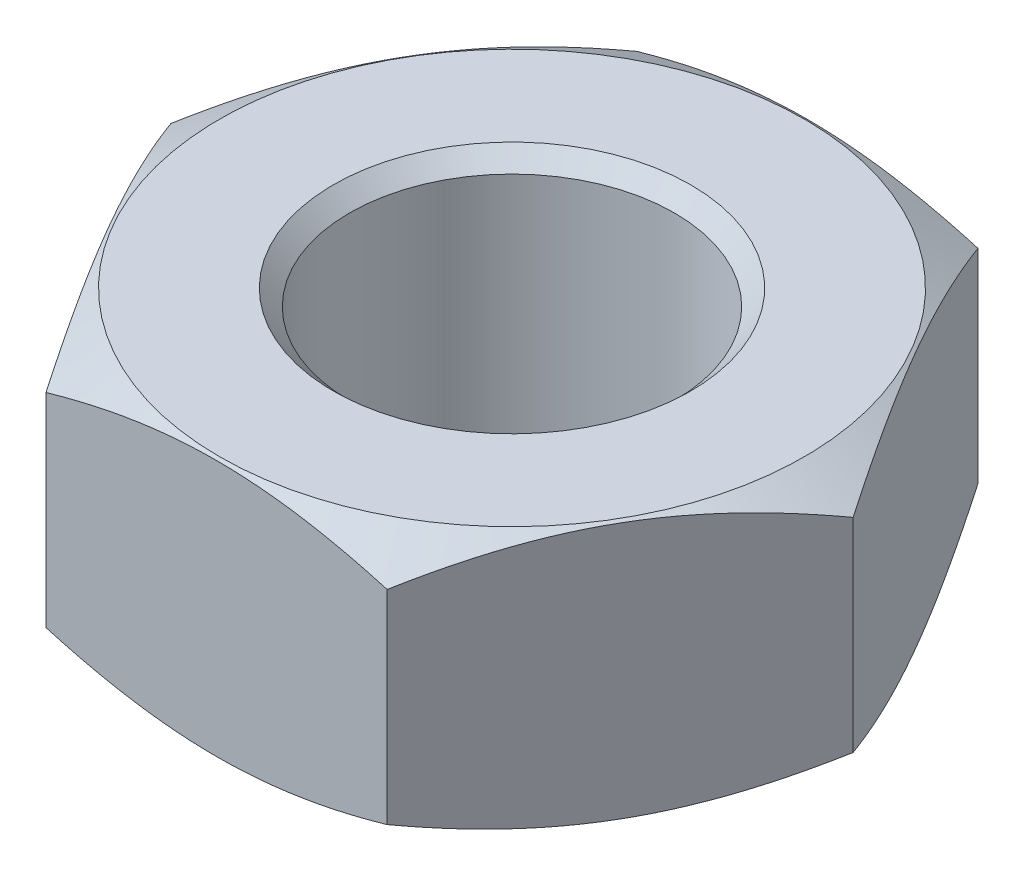
ISO-10303-21;
HEADER;
FILE_DESCRIPTION(('STEP AP214'),'2;1');
FILE_NAME('part.step','',(''),(''),'','','');
FILE_SCHEMA(('AUTOMOTIVE_DESIGN { 1 0 10303 214 1 1 1 1 }'));
ENDSEC;
DATA;
#1=APPLICATION_CONTEXT('core data for automotive mechanical design processes');
#2=APPLICATION_PROTOCOL_DEFINITION('international standard','automotive_design',2000,#1);
#3=PRODUCT_CONTEXT('',#1,'mechanical');
#4=PRODUCT('Part','Part','',(#3));
#5=PRODUCT_RELATED_PRODUCT_CATEGORY('part','',(#4));
#6=PRODUCT_DEFINITION_FORMATION('','',#4);
#7=PRODUCT_DEFINITION_CONTEXT('part definition',#1,'design');
#8=PRODUCT_DEFINITION('design','',#6,#7);
#9=PRODUCT_DEFINITION_SHAPE('','',#8);
#10=(LENGTH_UNIT() NAMED_UNIT(*) SI_UNIT(.MILLI.,.METRE.));
#11=(NAMED_UNIT(*) PLANE_ANGLE_UNIT() SI_UNIT($,.RADIAN.));
#12=(NAMED_UNIT(*) SI_UNIT($,.STERADIAN.) SOLID_ANGLE_UNIT());
#13=UNCERTAINTY_MEASURE_WITH_UNIT(LENGTH_MEASURE(1.E-05),#10,'distance_accuracy_value','');
#14=(GEOMETRIC_REPRESENTATION_CONTEXT(3) GLOBAL_UNCERTAINTY_ASSIGNED_CONTEXT((#13)) GLOBAL_UNIT_ASSIGNED_CONTEXT((#10,
#11,#12)) REPRESENTATION_CONTEXT('',''));
#15=CARTESIAN_POINT('',(0.,0.,0.));
#16=DIRECTION('',(0.,0.,1.));
#17=DIRECTION('',(1.,0.,0.));
#18=AXIS2_PLACEMENT_3D('',#15,#16,#17);
#19=CARTESIAN_POINT('',(-2.10000000237023,-1.6,0.));
#20=DIRECTION('',(-0.86602540378444,0.,-0.499999999999998));
#21=DIRECTION('',(-0.499999999999998,0.,0.86602540378444));
#22=AXIS2_PLACEMENT_3D('',#19,#20,#21);
#23=PLANE('',#22);
#24=CARTESIAN_POINT('',(-2.10011547242407,-1.42672824570972,0.000200000000008293));
#25=CARTESIAN_POINT('',(-2.05397238263355,-1.45338104386222,-0.0797221759353795));
#26=CARTESIAN_POINT('',(-2.00743099065545,-1.47762120515649,-0.16033423149643));
#27=CARTESIAN_POINT('',(-1.91354221479608,-1.51993359810462,-0.322954361545311));
#28=CARTESIAN_POINT('',(-1.86619316205928,-1.53799085955126,-0.404965326575708));
#29=CARTESIAN_POINT('',(-1.77208188818961,-1.56610091500609,-0.567970834482999));
#30=CARTESIAN_POINT('',(-1.72533415116147,-1.57634077429775,-0.648940290154616));
#31=CARTESIAN_POINT('',(-1.63161859927618,-1.58856728304991,-0.811260387479292));
#32=CARTESIAN_POINT('',(-1.58465112528045,-1.59056405473751,-0.89261043874307));
#33=CARTESIAN_POINT('',(-1.49688221921603,-1.58642049807779,-1.04463064337138));
#34=CARTESIAN_POINT('',(-1.45606767978037,-1.58129755658569,-1.11532349936147));
#35=CARTESIAN_POINT('',(-1.37470452019889,-1.56505760045516,-1.25624862562092));
#36=CARTESIAN_POINT('',(-1.33415618168559,-1.55393503279865,-1.32648040808847));
#37=CARTESIAN_POINT('',(-1.25262512890387,-1.52612820004511,-1.46769633390099));
#38=CARTESIAN_POINT('',(-1.21165273903499,-1.50932600741531,-1.53866259486141));
#39=CARTESIAN_POINT('',(-1.13031921847631,-1.47119114859348,-1.67953638482748));
#40=CARTESIAN_POINT('',(-1.08995704496168,-1.44986744868072,-1.74944572005874));
#41=CARTESIAN_POINT('',(-1.04988453113128,-1.42672824570972,-1.81885335));
#42=B_SPLINE_CURVE_WITH_KNOTS('',3,(#24,#25,#26,#27,#28,#29,#30,#31,#32,#33,#34,#35,#36,#37,#38,
#39,#40,#41),.UNSPECIFIED.,.F.,.F.,(4,2,2,2,2,2,2,2,4),(0.,0.288286928960491,0.577267010492272,
0.859094188183863,1.14057518869683,1.38571082227618,1.63107373404998,1.88188077320061,
2.13219502990154),.UNSPECIFIED.);
#43=CARTESIAN_POINT('',(-2.10000000237023,-1.42679491787466,0.));
#44=VERTEX_POINT('',#43);
#45=CARTESIAN_POINT('',(-1.05000000118512,-1.42679491787466,-1.81865335));
#46=VERTEX_POINT('',#45);
#47=EDGE_CURVE('E165',#44,#46,#42,.T.);
#48=ORIENTED_EDGE('',*,*,#47,.F.);
#49=DIRECTION('',(0.,1.,0.));
#50=VECTOR('',#49,1.);
#51=CARTESIAN_POINT('',(-2.10000000237023,-1.6,0.));
#52=LINE('',#51,#50);
#53=CARTESIAN_POINT('',(-2.10000000237023,-0.173205082125339,0.));
#54=VERTEX_POINT('',#53);
#55=EDGE_CURVE('E52',#44,#54,#52,.T.);
#56=ORIENTED_EDGE('',*,*,#55,.T.);
#57=CARTESIAN_POINT('',(-1.04988453113128,-0.173271754290277,-1.81885335));
#58=CARTESIAN_POINT('',(-1.0960276209218,-0.146618956137781,-1.73893117406461));
#59=CARTESIAN_POINT('',(-1.1425690128999,-0.122378794843514,-1.65831911850356));
#60=CARTESIAN_POINT('',(-1.23645778875927,-0.0800664018953775,-1.49569898845468));
#61=CARTESIAN_POINT('',(-1.28380684149607,-0.0620091404487364,-1.41368802342428));
#62=CARTESIAN_POINT('',(-1.37791811536574,-0.0338990849939134,-1.25068251551699));
#63=CARTESIAN_POINT('',(-1.42466585239388,-0.0236592257022503,-1.16971305984538));
#64=CARTESIAN_POINT('',(-1.51838140427917,-0.0114327169500914,-1.0073929625207));
#65=CARTESIAN_POINT('',(-1.5653488782749,-0.00943594526248743,-0.926042911256921));
#66=CARTESIAN_POINT('',(-1.65311778433932,-0.0135795019222064,-0.774022706628614));
#67=CARTESIAN_POINT('',(-1.69393232377498,-0.0187024434143125,-0.703329850638519));
#68=CARTESIAN_POINT('',(-1.77529548335645,-0.0349423995448412,-0.56240472437907));
#69=CARTESIAN_POINT('',(-1.81584382186976,-0.0460649672013528,-0.492172941911518));
#70=CARTESIAN_POINT('',(-1.89737487465148,-0.0738717999548946,-0.350957016098998));
#71=CARTESIAN_POINT('',(-1.93834726452036,-0.090673992584695,-0.27999075513858));
#72=CARTESIAN_POINT('',(-2.01968078507903,-0.128808851406522,-0.139116965172509));
#73=CARTESIAN_POINT('',(-2.06004295859367,-0.15013255131928,-0.0692076299412518));
#74=CARTESIAN_POINT('',(-2.10011547242407,-0.173271754290277,0.000200000000008304));
#75=B_SPLINE_CURVE_WITH_KNOTS('',3,(#57,#58,#59,#60,#61,#62,#63,#64,#65,#66,#67,#68,#69,#70,#71,
#72,#73,#74),.UNSPECIFIED.,.F.,.F.,(4,2,2,2,2,2,2,2,4),(0.,0.288286928960491,0.577267010492272,
0.859094188183863,1.14057518869683,1.38571082227618,1.63107373404998,1.88188077320061,
2.13219502990154),.UNSPECIFIED.);
#76=CARTESIAN_POINT('',(-1.05000000118512,-0.173205082125339,-1.81865335));
#77=VERTEX_POINT('',#76);
#78=EDGE_CURVE('E112',#77,#54,#75,.T.);
#79=ORIENTED_EDGE('',*,*,#78,.F.);
#80=DIRECTION('',(0.,1.,0.));
#81=VECTOR('',#80,1.);
#82=CARTESIAN_POINT('',(-1.05000000118512,-1.6,-1.81865335));
#83=LINE('',#82,#81);
#84=EDGE_CURVE('E117',#46,#77,#83,.T.);
#85=ORIENTED_EDGE('',*,*,#84,.F.);
#86=EDGE_LOOP('',(#48,#56,#79,#85));
#87=FACE_BOUND('',#86,.T.);
#88=ADVANCED_FACE('F29',(#87),#23,.T.);
#89=CARTESIAN_POINT('',(-1.05000000118512,-1.6,-1.81865335));
#90=DIRECTION('',(0.,0.,-1.));
#91=DIRECTION('',(-1.,0.,0.));
#92=AXIS2_PLACEMENT_3D('',#89,#90,#91);
#93=PLANE('',#92);
#94=CARTESIAN_POINT('',(-2.7832612700738,-0.719678166511685,-1.81865335));
#95=CARTESIAN_POINT('',(-2.70342372155906,-0.758253875418694,-1.81865335));
#96=CARTESIAN_POINT('',(-2.6233972415429,-0.796445651858814,-1.81865335));
#97=CARTESIAN_POINT('',(-2.46286425560241,-0.871841912645935,-1.81865335));
#98=CARTESIAN_POINT('',(-2.38235766932415,-0.909046225701725,-1.81865335));
#99=CARTESIAN_POINT('',(-2.22032668005602,-0.982444452958837,-1.81865335));
#100=CARTESIAN_POINT('',(-2.13879908801237,-1.01863135259055,-1.81865335));
#101=CARTESIAN_POINT('',(-1.97507326653739,-1.08944868357841,-1.81865335));
#102=CARTESIAN_POINT('',(-1.89287507238346,-1.12407919619328,-1.81865335));
#103=CARTESIAN_POINT('',(-1.72666416503013,-1.19177797582275,-1.81865335));
#104=CARTESIAN_POINT('',(-1.64264154679091,-1.22482205798241,-1.81865335));
#105=CARTESIAN_POINT('',(-1.47360407595019,-1.28831874817367,-1.81865335));
#106=CARTESIAN_POINT('',(-1.38858910652799,-1.31877104752658,-1.81865335));
#107=CARTESIAN_POINT('',(-1.21761127063947,-1.37626323007243,-1.81865335));
#108=CARTESIAN_POINT('',(-1.13165092346202,-1.40331052878013,-1.81865335));
#109=CARTESIAN_POINT('',(-0.958501219430261,-1.45311713415704,-1.81865335));
#110=CARTESIAN_POINT('',(-0.871312155804668,-1.47587744588,-1.81865335));
#111=CARTESIAN_POINT('',(-0.69565519737154,-1.51600043048016,-1.81865335));
#112=CARTESIAN_POINT('',(-0.607187001422664,-1.53336180991866,-1.81865335));
#113=CARTESIAN_POINT('',(-0.429186326856783,-1.56151878870486,-1.81865335));
#114=CARTESIAN_POINT('',(-0.339653847029726,-1.57231438058678,-1.81865335));
#115=CARTESIAN_POINT('',(-0.160555912135001,-1.58638171668875,-1.81865335));
#116=CARTESIAN_POINT('',(-0.0709942979807151,-1.58970093661517,-1.81865335));
#117=CARTESIAN_POINT('',(0.108054607245679,-1.58865102717667,-1.81865335));
#118=CARTESIAN_POINT('',(0.197541911548648,-1.58428388586576,-1.81865335));
#119=CARTESIAN_POINT('',(0.414124965282245,-1.56480056661687,-1.81865335));
#120=CARTESIAN_POINT('',(0.540878771012093,-1.54587559981539,-1.81865335));
#121=CARTESIAN_POINT('',(0.792038298823614,-1.49602046956849,-1.81865335));
#122=CARTESIAN_POINT('',(0.916441072917053,-1.46507616291958,-1.81865335));
#123=CARTESIAN_POINT('',(1.10262559572244,-1.41172648055705,-1.81865335));
#124=CARTESIAN_POINT('',(1.16535961271617,-1.39251631221724,-1.81865335));
#125=CARTESIAN_POINT('',(1.29016933189334,-1.35219760100933,-1.81865335));
#126=CARTESIAN_POINT('',(1.35224545593244,-1.33109036870646,-1.81865335));
#127=CARTESIAN_POINT('',(1.47548420013221,-1.28741728061417,-1.81865335));
#128=CARTESIAN_POINT('',(1.53664999612024,-1.26486030924131,-1.81865335));
#129=CARTESIAN_POINT('',(1.65850729578319,-1.21842444820772,-1.81865335));
#130=CARTESIAN_POINT('',(1.7191985957868,-1.19454502301362,-1.81865335));
#131=CARTESIAN_POINT('',(1.77967015229902,-1.17013486041854,-1.81865335));
#132=B_SPLINE_CURVE_WITH_KNOTS('',3,(#94,#95,#96,#97,#98,#99,#100,#101,#102,#103,#104,#105,#106,
#107,#108,#109,#110,#111,#112,#113,#114,#115,#116,#117,#118,#119,#120,#121,#122,#123,#124,#125,
#126,#127,#128,#129,#130,#131),.UNSPECIFIED.,.F.,.F.,(4,2,2,2,2,2,2,2,2,2,2,2,2,2,2,2,2,2,4),
(0.,0.266009359535983,0.532064564974267,0.799644907168761,1.06721126276623,1.33803870986606,
1.60889836723221,1.87915753998676,2.14935327331235,2.41961368847551,2.68987441094453,
2.95841405381912,3.22688424993656,3.61057360782347,3.99471582894789,4.19152075009795,
4.38819074077493,4.58375309303951,4.77939522658699),.UNSPECIFIED.);
#133=CARTESIAN_POINT('',(1.05000000118511,-1.42679491787466,-1.81865335));
#134=VERTEX_POINT('',#133);
#135=EDGE_CURVE('E168',#46,#134,#132,.T.);
#136=ORIENTED_EDGE('',*,*,#135,.F.);
#137=ORIENTED_EDGE('',*,*,#84,.T.);
#138=CARTESIAN_POINT('',(-2.7832612700738,-0.880321833488316,-1.81865335));
#139=CARTESIAN_POINT('',(-2.70342372155906,-0.841746124581307,-1.81865335));
#140=CARTESIAN_POINT('',(-2.6233972415429,-0.803554348141187,-1.81865335));
#141=CARTESIAN_POINT('',(-2.46286425560241,-0.728158087354065,-1.81865335));
#142=CARTESIAN_POINT('',(-2.38235766932415,-0.690953774298275,-1.81865335));
#143=CARTESIAN_POINT('',(-2.22032668005602,-0.617555547041164,-1.81865335));
#144=CARTESIAN_POINT('',(-2.13879908801237,-0.58136864740945,-1.81865335));
#145=CARTESIAN_POINT('',(-1.97507326653739,-0.510551316421594,-1.81865335));
#146=CARTESIAN_POINT('',(-1.89287507238346,-0.475920803806722,-1.81865335));
#147=CARTESIAN_POINT('',(-1.72666416503013,-0.408222024177251,-1.81865335));
#148=CARTESIAN_POINT('',(-1.64264154679091,-0.375177942017588,-1.81865335));
#149=CARTESIAN_POINT('',(-1.47360407595019,-0.311681251826333,-1.81865335));
#150=CARTESIAN_POINT('',(-1.38858910652799,-0.281228952473421,-1.81865335));
#151=CARTESIAN_POINT('',(-1.21761127063947,-0.223736769927567,-1.81865335));
#152=CARTESIAN_POINT('',(-1.13165092346202,-0.19668947121987,-1.81865335));
#153=CARTESIAN_POINT('',(-0.958501219430261,-0.146882865842958,-1.81865335));
#154=CARTESIAN_POINT('',(-0.871312155804667,-0.124122554120004,-1.81865335));
#155=CARTESIAN_POINT('',(-0.69565519737154,-0.0839995695198386,-1.81865335));
#156=CARTESIAN_POINT('',(-0.607187001422664,-0.066638190081343,-1.81865335));
#157=CARTESIAN_POINT('',(-0.429186326856783,-0.0384812112951381,-1.81865335));
#158=CARTESIAN_POINT('',(-0.339653847029726,-0.0276856194132233,-1.81865335));
#159=CARTESIAN_POINT('',(-0.160555912135001,-0.013618283311247,-1.81865335));
#160=CARTESIAN_POINT('',(-0.0709942979807154,-0.010299063384826,-1.81865335));
#161=CARTESIAN_POINT('',(0.108054607245679,-0.0113489728233268,-1.81865335));
#162=CARTESIAN_POINT('',(0.197541911548648,-0.0157161141342362,-1.81865335));
#163=CARTESIAN_POINT('',(0.414124965282245,-0.0351994333831336,-1.81865335));
#164=CARTESIAN_POINT('',(0.540878771012093,-0.0541244001846105,-1.81865335));
#165=CARTESIAN_POINT('',(0.792038298823615,-0.103979530431506,-1.81865335));
#166=CARTESIAN_POINT('',(0.916441072917053,-0.134923837080424,-1.81865335));
#167=CARTESIAN_POINT('',(1.10262559572244,-0.188273519442946,-1.81865335));
#168=CARTESIAN_POINT('',(1.16535961271617,-0.207483687782762,-1.81865335));
#169=CARTESIAN_POINT('',(1.29016933189334,-0.247802398990675,-1.81865335));
#170=CARTESIAN_POINT('',(1.35224545593244,-0.268909631293539,-1.81865335));
#171=CARTESIAN_POINT('',(1.47548420013221,-0.312582719385827,-1.81865335));
#172=CARTESIAN_POINT('',(1.53664999612024,-0.335139690758688,-1.81865335));
#173=CARTESIAN_POINT('',(1.65850729578319,-0.381575551792282,-1.81865335));
#174=CARTESIAN_POINT('',(1.7191985957868,-0.405454976986384,-1.81865335));
#175=CARTESIAN_POINT('',(1.77967015229902,-0.429865139581464,-1.81865335));
#176=B_SPLINE_CURVE_WITH_KNOTS('',3,(#138,#139,#140,#141,#142,#143,#144,#145,#146,#147,#148,
#149,#150,#151,#152,#153,#154,#155,#156,#157,#158,#159,#160,#161,#162,#163,#164,#165,#166,#167,
#168,#169,#170,#171,#172,#173,#174,#175),.UNSPECIFIED.,.F.,.F.,(4,2,2,2,2,2,2,2,2,2,2,2,2,2,2,2,
2,2,4),(0.,0.266009359535983,0.532064564974268,0.799644907168762,1.06721126276623,
1.33803870986606,1.60889836723221,1.87915753998676,2.14935327331235,2.41961368847551,
2.68987441094453,2.95841405381912,3.22688424993656,3.61057360782347,3.99471582894789,
4.19152075009795,4.38819074077493,4.58375309303951,4.77939522658699),.UNSPECIFIED.);
#177=CARTESIAN_POINT('',(1.05000000118511,-0.173205082125339,-1.81865335));
#178=VERTEX_POINT('',#177);
#179=EDGE_CURVE('E210',#178,#77,#176,.F.);
#180=ORIENTED_EDGE('',*,*,#179,.F.);
#181=DIRECTION('',(0.,1.,0.));
#182=VECTOR('',#181,1.);
#183=CARTESIAN_POINT('',(1.05000000118512,-1.6,-1.81865335));
#184=LINE('',#183,#182);
#185=EDGE_CURVE('E106',#134,#178,#184,.T.);
#186=ORIENTED_EDGE('',*,*,#185,.F.);
#187=EDGE_LOOP('',(#136,#137,#180,#186));
#188=FACE_BOUND('',#187,.T.);
#189=ADVANCED_FACE('F158',(#188),#93,.T.);
#190=CARTESIAN_POINT('',(1.05000000118512,-1.6,-1.81865335));
#191=DIRECTION('',(0.866025403784439,0.,-0.5));
#192=DIRECTION('',(-0.5,0.,-0.866025403784439));
#193=AXIS2_PLACEMENT_3D('',#190,#191,#192);
#194=PLANE('',#193);
#195=CARTESIAN_POINT('',(1.04988453113128,-1.42672824570972,-1.81885335));
#196=CARTESIAN_POINT('',(1.09602762092102,-1.45338104386178,-1.73893117406595));
#197=CARTESIAN_POINT('',(1.14256901289835,-1.47762120515568,-1.65831911850625));
#198=CARTESIAN_POINT('',(1.23645778875604,-1.51993359810327,-1.49569898846028));
#199=CARTESIAN_POINT('',(1.28380684149193,-1.53799085954975,-1.41368802343144));
#200=CARTESIAN_POINT('',(1.37791811536146,-1.56610091500509,-1.25068251552439));
#201=CARTESIAN_POINT('',(1.4246658523904,-1.57634077429716,-1.16971305985141));
#202=CARTESIAN_POINT('',(1.5183814042774,-1.58856728304981,-1.00739296252376));
#203=CARTESIAN_POINT('',(1.56534887827407,-1.59056405473749,-0.926042911258365));
#204=CARTESIAN_POINT('',(1.65311778413914,-1.5864204980873,-0.774022706975326));
#205=CARTESIAN_POINT('',(1.69393232337496,-1.58129755663608,-0.703329851331371));
#206=CARTESIAN_POINT('',(1.77529548256007,-1.56505760064361,-0.562404725758448));
#207=CARTESIAN_POINT('',(1.81584382087687,-1.5539350330844,-0.492172943631269));
#208=CARTESIAN_POINT('',(1.89737487326101,-1.52612820057349,-0.350957018507378));
#209=CARTESIAN_POINT('',(1.93834726292901,-1.50932600809078,-0.279990757894878));
#210=CARTESIAN_POINT('',(2.01968078309326,-1.47119114959511,-0.139116968611979));
#211=CARTESIAN_POINT('',(2.06004295641431,-1.44986744986123,-0.0692076337160199));
#212=CARTESIAN_POINT('',(2.10011547005384,-1.4267282470784,0.000199995894644618));
#213=B_SPLINE_CURVE_WITH_KNOTS('',3,(#195,#196,#197,#198,#199,#200,#201,#202,#203,#204,#205,
#206,#207,#208,#209,#210,#211,#212),.UNSPECIFIED.,.F.,.F.,(4,2,2,2,2,2,2,2,4),(0.,
0.288286928955696,0.577267010482063,0.859094188178533,1.14057518869683,1.38571082107542,
1.63107373164402,1.88188076952682,2.13219502496959),.UNSPECIFIED.);
#214=CARTESIAN_POINT('',(2.10000000237023,-1.42679491787466,-8.21071617813918E-09));
#215=VERTEX_POINT('',#214);
#216=EDGE_CURVE('E86',#134,#215,#213,.T.);
#217=ORIENTED_EDGE('',*,*,#216,.F.);
#218=ORIENTED_EDGE('',*,*,#185,.T.);
#219=CARTESIAN_POINT('',(2.10011547005384,-0.173271752921598,0.000199995894644444));
#220=CARTESIAN_POINT('',(2.05397238030256,-0.146618954881059,-0.0797221799727852));
#221=CARTESIAN_POINT('',(2.00743098836394,-0.122378793705811,-0.16033423546545));
#222=CARTESIAN_POINT('',(1.91354221258737,-0.0800664010049097,-0.322954365370917));
#223=CARTESIAN_POINT('',(1.86619315989391,-0.0620091396863438,-0.404965330326244));
#224=CARTESIAN_POINT('',(1.77208188611084,-0.0338990844855622,-0.567970838083534));
#225=CARTESIAN_POINT('',(1.7253341491258,-0.0236592253203681,-0.648940293680489));
#226=CARTESIAN_POINT('',(1.63161859733177,-0.0114327168123517,-0.811260390847104));
#227=CARTESIAN_POINT('',(1.58465112338418,-0.00943594524251173,-0.892610442027501));
#228=CARTESIAN_POINT('',(1.49688221752103,-0.0135795020978191,-1.04463064630721));
#229=CARTESIAN_POINT('',(1.45606767823768,-0.0187024436536201,-1.11532350203348));
#230=CARTESIAN_POINT('',(1.37470451896134,-0.034942399860557,-1.25624862776442));
#231=CARTESIAN_POINT('',(1.33415618060085,-0.0460649675296701,-1.32648040996729));
#232=CARTESIAN_POINT('',(1.25262512813019,-0.0738718002614024,-1.46769633524104));
#233=CARTESIAN_POINT('',(1.21165273841945,-0.0906739928551463,-1.53866259592756));
#234=CARTESIAN_POINT('',(1.13031921817217,-0.128808851567253,-1.67953638535427));
#235=CARTESIAN_POINT('',(1.08995704481082,-0.150132551406498,-1.74944572032004));
#236=CARTESIAN_POINT('',(1.04988453113128,-0.173271754290276,-1.81885335));
#237=B_SPLINE_CURVE_WITH_KNOTS('',3,(#219,#220,#221,#222,#223,#224,#225,#226,#227,#228,#229,
#230,#231,#232,#233,#234,#235,#236),.UNSPECIFIED.,.F.,.F.,(4,2,2,2,2,2,2,2,4),(0.,
0.288286928640666,0.577267009844349,0.859094187237457,1.14057518745504,1.38571082013735,
1.63107373101064,1.88188076921193,2.13219502496959),.UNSPECIFIED.);
#238=CARTESIAN_POINT('',(2.10000000237023,-0.173205082125339,-8.21071617813918E-09));
#239=VERTEX_POINT('',#238);
#240=EDGE_CURVE('E204',#239,#178,#237,.T.);
#241=ORIENTED_EDGE('',*,*,#240,.F.);
#242=DIRECTION('',(0.,1.,0.));
#243=VECTOR('',#242,1.);
#244=CARTESIAN_POINT('',(2.1,-1.6,-4.10535559540459E-09));
#245=LINE('',#244,#243);
#246=EDGE_CURVE('E104',#215,#239,#245,.T.);
#247=ORIENTED_EDGE('',*,*,#246,.F.);
#248=EDGE_LOOP('',(#217,#218,#241,#247));
#249=FACE_BOUND('',#248,.T.);
#250=ADVANCED_FACE('F162',(#249),#194,.T.);
#251=CARTESIAN_POINT('',(2.1,-1.6,-4.10535559540459E-09));
#252=DIRECTION('',(0.866025403784436,0.,0.500000000000005));
#253=DIRECTION('',(0.500000000000005,0.,-0.866025403784436));
#254=AXIS2_PLACEMENT_3D('',#251,#252,#253);
#255=PLANE('',#254);
#256=CARTESIAN_POINT('',(2.10011547005384,-1.42672824707795,-0.000200004105355633));
#257=CARTESIAN_POINT('',(2.05397238032747,-1.45338104528269,0.0797221717189179));
#258=CARTESIAN_POINT('',(2.00743098841417,-1.47762120664163,0.160334227167742));
#259=CARTESIAN_POINT('',(1.91354221268224,-1.51993359974207,0.322954356995871));
#260=CARTESIAN_POINT('',(1.86619316000807,-1.5379908612762,0.404965321917782));
#261=CARTESIAN_POINT('',(1.7720818862641,-1.56610091692112,0.567970829607362));
#262=CARTESIAN_POINT('',(1.72533414929916,-1.57634077631574,0.648940285169507));
#263=CARTESIAN_POINT('',(1.63161859753587,-1.58856728528398,0.811260382282866));
#264=CARTESIAN_POINT('',(1.58465112359895,-1.59056405708478,0.892610433444785));
#265=CARTESIAN_POINT('',(1.49688221733201,-1.58642050062049,1.04463063842387));
#266=CARTESIAN_POINT('',(1.45606767763628,-1.58129755916276,1.11532349486441));
#267=CARTESIAN_POINT('',(1.37470451753689,-1.56505760300724,1.25624862202091));
#268=CARTESIAN_POINT('',(1.33415617876575,-1.55393503529112,1.32648040493504));
#269=CARTESIAN_POINT('',(1.25262512545936,-1.52612820233588,1.46769633165632));
#270=CARTESIAN_POINT('',(1.21165273532392,-1.50932600956085,1.53866259307843));
#271=CARTESIAN_POINT('',(1.13031921424294,-1.47119115038918,1.67953638394916));
#272=CARTESIAN_POINT('',(1.08995704047252,-1.44986745027214,1.74944571962346));
#273=CARTESIAN_POINT('',(1.04988452639081,-1.42672824707795,1.81885335));
#274=B_SPLINE_CURVE_WITH_KNOTS('',3,(#256,#257,#258,#259,#260,#261,#262,#263,#264,#265,#266,
#267,#268,#269,#270,#271,#272,#273),.UNSPECIFIED.,.F.,.F.,(4,2,2,2,2,2,2,2,4),(0.,
0.288286928634379,0.577267009847374,0.859094187196416,1.14057518736407,1.38571082248809,
1.63107373581395,1.88188077661583,2.13219503495339),.UNSPECIFIED.);
#275=CARTESIAN_POINT('',(1.05000000118512,-1.42679491787466,1.81865335));
#276=VERTEX_POINT('',#275);
#277=EDGE_CURVE('E82',#215,#276,#274,.T.);
#278=ORIENTED_EDGE('',*,*,#277,.F.);
#279=ORIENTED_EDGE('',*,*,#246,.T.);
#280=CARTESIAN_POINT('',(1.04988452639081,-0.173271752922046,1.81885335));
#281=CARTESIAN_POINT('',(1.09602761611717,-0.146618954717307,1.73893117417573));
#282=CARTESIAN_POINT('',(1.14256900803048,-0.122378793358362,1.6583191187269));
#283=CARTESIAN_POINT('',(1.2364577837624,-0.0800664002579312,1.49569898889877));
#284=CARTESIAN_POINT('',(1.28380683643657,-0.062009138723796,1.41368802397686));
#285=CARTESIAN_POINT('',(1.37791811018054,-0.0338990830788741,1.25068251628728));
#286=CARTESIAN_POINT('',(1.42466584714548,-0.023659223684255,1.16971306072514));
#287=CARTESIAN_POINT('',(1.51838139890877,-0.0114327147160211,1.00739296361178));
#288=CARTESIAN_POINT('',(1.56534887284569,-0.00943594291521794,0.926042912449861));
#289=CARTESIAN_POINT('',(1.65311777911263,-0.0135794993795064,0.774022707470776));
#290=CARTESIAN_POINT('',(1.69393231880836,-0.018702440837236,0.703329851030231));
#291=CARTESIAN_POINT('',(1.77529547890775,-0.0349423969927607,0.562404723873735));
#292=CARTESIAN_POINT('',(1.81584381767889,-0.0460649647088775,0.492172940959605));
#293=CARTESIAN_POINT('',(1.89737487098529,-0.0738717976641205,0.35095701423832));
#294=CARTESIAN_POINT('',(1.93834726112072,-0.0906739904391554,0.279990752816213));
#295=CARTESIAN_POINT('',(2.0196807822017,-0.128808849610825,0.139116961945484));
#296=CARTESIAN_POINT('',(2.06004295597213,-0.150132549727866,0.0692076262711872));
#297=CARTESIAN_POINT('',(2.10011547005384,-0.17327175292205,-0.000200004105355586));
#298=B_SPLINE_CURVE_WITH_KNOTS('',3,(#280,#281,#282,#283,#284,#285,#286,#287,#288,#289,#290,
#291,#292,#293,#294,#295,#296,#297),.UNSPECIFIED.,.F.,.F.,(4,2,2,2,2,2,2,2,4),(0.,
0.288286928634378,0.577267009847372,0.859094187196414,1.14057518736407,1.38571082248809,
1.63107373581395,1.88188077661583,2.13219503495339),.UNSPECIFIED.);
#299=CARTESIAN_POINT('',(1.05000000118512,-0.173205082125339,1.81865335));
#300=VERTEX_POINT('',#299);
#301=EDGE_CURVE('E103',#300,#239,#298,.T.);
#302=ORIENTED_EDGE('',*,*,#301,.F.);
#303=DIRECTION('',(0.,1.,0.));
#304=VECTOR('',#303,1.);
#305=CARTESIAN_POINT('',(1.04999999644464,-1.6,1.81865335));
#306=LINE('',#305,#304);
#307=EDGE_CURVE('E95',#276,#300,#306,.T.);
#308=ORIENTED_EDGE('',*,*,#307,.F.);
#309=EDGE_LOOP('',(#278,#279,#302,#308));
#310=FACE_BOUND('',#309,.T.);
#311=ADVANCED_FACE('F101',(#310),#255,.T.);
#312=CARTESIAN_POINT('',(1.04999999644464,-1.6,1.81865335));
#313=DIRECTION('',(0.,0.,1.));
#314=DIRECTION('',(1.,0.,0.));
#315=AXIS2_PLACEMENT_3D('',#312,#313,#314);
#316=PLANE('',#315);
#317=CARTESIAN_POINT('',(-2.78326256947698,-0.719677538486986,1.81865335));
#318=CARTESIAN_POINT('',(-2.70342497650246,-0.758253274261409,1.81865335));
#319=CARTESIAN_POINT('',(-2.6233984519926,-0.796445077553366,1.81865335));
#320=CARTESIAN_POINT('',(-2.46286537691597,-0.87184139190162,1.81865335));
#321=CARTESIAN_POINT('',(-2.38235874599525,-0.909045731666684,1.81865335));
#322=CARTESIAN_POINT('',(-2.22032766669492,-0.982444012356661,1.81865335));
#323=CARTESIAN_POINT('',(-2.13880002925838,-1.01863093870626,1.81865335));
#324=CARTESIAN_POINT('',(-1.97507411665983,-1.08944832263868,1.81865335));
#325=CARTESIAN_POINT('',(-1.89287587677524,-1.12407886148027,1.81865335));
#326=CARTESIAN_POINT('',(-1.7266648767376,-1.19177769310805,1.81865335));
#327=CARTESIAN_POINT('',(-1.64264221153696,-1.22482180102547,1.81865335));
#328=CARTESIAN_POINT('',(-1.47360464598758,-1.28831854130379,1.81865335));
#329=CARTESIAN_POINT('',(-1.38858962881791,-1.31877086498553,1.81865335));
#330=CARTESIAN_POINT('',(-1.21761169653594,-1.37626309376513,1.81865335));
#331=CARTESIAN_POINT('',(-1.13165130071588,-1.40331041438582,1.81865335));
#332=CARTESIAN_POINT('',(-0.958501498051143,-1.45311705988368,1.81865335));
#333=CARTESIAN_POINT('',(-0.871312384435818,-1.47587738981649,1.81865335));
#334=CARTESIAN_POINT('',(-0.695655298347124,-1.51600041125152,1.81865335));
#335=CARTESIAN_POINT('',(-0.607187024358328,-1.53336180770859,1.81865335));
#336=CARTESIAN_POINT('',(-0.429186191962489,-1.56151880862757,1.81865335));
#337=CARTESIAN_POINT('',(-0.339653632346777,-1.57231440563221,1.81865335));
#338=CARTESIAN_POINT('',(-0.160555538258592,-1.58638173793835,1.81865335));
#339=CARTESIAN_POINT('',(-0.0709938447047107,-1.58970094906322,1.81865335));
#340=CARTESIAN_POINT('',(0.108055217959703,-1.58865100846985,1.81865335));
#341=CARTESIAN_POINT('',(0.197542600301418,-1.58428384480258,1.81865335));
#342=CARTESIAN_POINT('',(0.414125777051288,-1.5648004638249,1.81865335));
#343=CARTESIAN_POINT('',(0.540879626962814,-1.54587545942443,1.81865335));
#344=CARTESIAN_POINT('',(0.792039240116344,-1.49602025292715,1.81865335));
#345=CARTESIAN_POINT('',(0.916442055364486,-1.46507590761662,1.81865335));
#346=CARTESIAN_POINT('',(1.10262663968978,-1.41172616803371,1.81865335));
#347=CARTESIAN_POINT('',(1.16536067753099,-1.3925159804778,1.81865335));
#348=CARTESIAN_POINT('',(1.29017043816618,-1.35219723139353,1.81865335));
#349=CARTESIAN_POINT('',(1.35224658281613,-1.33108998043066,1.81865335));
#350=CARTESIAN_POINT('',(1.47548536794005,-1.2874168557468,1.81865335));
#351=CARTESIAN_POINT('',(1.53665118424278,-1.26485986644185,1.81865335));
#352=CARTESIAN_POINT('',(1.65850852457951,-1.21842397008282,1.81865335));
#353=CARTESIAN_POINT('',(1.7191998449419,-1.1945445274948,1.81865335));
#354=CARTESIAN_POINT('',(1.77967142184711,-1.1701343477727,1.81865335));
#355=B_SPLINE_CURVE_WITH_KNOTS('',3,(#317,#318,#319,#320,#321,#322,#323,#324,#325,#326,#327,
#328,#329,#330,#331,#332,#333,#334,#335,#336,#337,#338,#339,#340,#341,#342,#343,#344,#345,#346,
#347,#348,#349,#350,#351,#352,#353,#354),.UNSPECIFIED.,.F.,.F.,(4,2,2,2,2,2,2,2,2,2,2,2,2,2,2,2,
2,2,4),(0.,0.266009514698696,0.532064875325428,0.799645374506284,1.06721188707755,
1.33803949355381,1.60889931034811,1.87915864194376,2.14935453400788,2.41961518820576,
2.68987614935782,2.95841602837786,3.22688646080837,3.61057596626972,3.99471833543253,
4.19152333328643,4.38819340055101,4.58375582862689,4.77939803813518),.UNSPECIFIED.);
#356=CARTESIAN_POINT('',(-1.05000000118511,-1.42679491787466,1.81865335));
#357=VERTEX_POINT('',#356);
#358=EDGE_CURVE('E44',#276,#357,#355,.F.);
#359=ORIENTED_EDGE('',*,*,#358,.F.);
#360=ORIENTED_EDGE('',*,*,#307,.T.);
#361=CARTESIAN_POINT('',(-2.78326256947698,-0.880322461513014,1.81865335));
#362=CARTESIAN_POINT('',(-2.70342497650246,-0.841746725738592,1.81865335));
#363=CARTESIAN_POINT('',(-2.6233984519926,-0.803554922446635,1.81865335));
#364=CARTESIAN_POINT('',(-2.46286537691597,-0.728158608098381,1.81865335));
#365=CARTESIAN_POINT('',(-2.38235874599526,-0.690954268333317,1.81865335));
#366=CARTESIAN_POINT('',(-2.22032766669492,-0.617555987643341,1.81865335));
#367=CARTESIAN_POINT('',(-2.13880002925839,-0.581369061293738,1.81865335));
#368=CARTESIAN_POINT('',(-1.97507411665983,-0.510551677361325,1.81865335));
#369=CARTESIAN_POINT('',(-1.89287587677524,-0.475921138519735,1.81865335));
#370=CARTESIAN_POINT('',(-1.7266648767376,-0.408222306891947,1.81865335));
#371=CARTESIAN_POINT('',(-1.64264221153696,-0.375178198974529,1.81865335));
#372=CARTESIAN_POINT('',(-1.47360464598758,-0.311681458696207,1.81865335));
#373=CARTESIAN_POINT('',(-1.38858962881791,-0.281229135014468,1.81865335));
#374=CARTESIAN_POINT('',(-1.21761169653594,-0.223736906234873,1.81865335));
#375=CARTESIAN_POINT('',(-1.13165130071588,-0.196689585614179,1.81865335));
#376=CARTESIAN_POINT('',(-0.958501498051143,-0.14688294011632,1.81865335));
#377=CARTESIAN_POINT('',(-0.871312384435818,-0.124122610183515,1.81865335));
#378=CARTESIAN_POINT('',(-0.695655298347124,-0.0839995887484799,1.81865335));
#379=CARTESIAN_POINT('',(-0.607187024358327,-0.0666381922914052,1.81865335));
#380=CARTESIAN_POINT('',(-0.429186191962488,-0.0384811913724303,1.81865335));
#381=CARTESIAN_POINT('',(-0.339653632346776,-0.0276855943677876,1.81865335));
#382=CARTESIAN_POINT('',(-0.160555538258591,-0.013618262061654,1.81865335));
#383=CARTESIAN_POINT('',(-0.0709938447047099,-0.0102990509367819,1.81865335));
#384=CARTESIAN_POINT('',(0.108055217959703,-0.0113489915301505,1.81865335));
#385=CARTESIAN_POINT('',(0.197542600301418,-0.01571615519742,1.81865335));
#386=CARTESIAN_POINT('',(0.414125777051287,-0.0351995361751027,1.81865335));
#387=CARTESIAN_POINT('',(0.540879626962814,-0.0541245405755694,1.81865335));
#388=CARTESIAN_POINT('',(0.792039240116343,-0.103979747072849,1.81865335));
#389=CARTESIAN_POINT('',(0.916442055364485,-0.134924092383383,1.81865335));
#390=CARTESIAN_POINT('',(1.10262663968978,-0.18827383196629,1.81865335));
#391=CARTESIAN_POINT('',(1.16536067753099,-0.207484019522198,1.81865335));
#392=CARTESIAN_POINT('',(1.29017043816618,-0.247802768606466,1.81865335));
#393=CARTESIAN_POINT('',(1.35224658281612,-0.268910019569343,1.81865335));
#394=CARTESIAN_POINT('',(1.47548536794005,-0.312583144253198,1.81865335));
#395=CARTESIAN_POINT('',(1.53665118424278,-0.335140133558148,1.81865335));
#396=CARTESIAN_POINT('',(1.6585085245795,-0.381576029917179,1.81865335));
#397=CARTESIAN_POINT('',(1.7191998449419,-0.405455472505198,1.81865335));
#398=CARTESIAN_POINT('',(1.77967142184711,-0.429865652227298,1.81865335));
#399=B_SPLINE_CURVE_WITH_KNOTS('',3,(#361,#362,#363,#364,#365,#366,#367,#368,#369,#370,#371,
#372,#373,#374,#375,#376,#377,#378,#379,#380,#381,#382,#383,#384,#385,#386,#387,#388,#389,#390,
#391,#392,#393,#394,#395,#396,#397,#398),.UNSPECIFIED.,.F.,.F.,(4,2,2,2,2,2,2,2,2,2,2,2,2,2,2,2,
2,2,4),(0.,0.266009514698695,0.532064875325426,0.799645374506281,1.06721188707755,
1.3380394935538,1.60889931034811,1.87915864194376,2.14935453400788,2.41961518820576,
2.68987614935782,2.95841602837786,3.22688646080837,3.61057596626972,3.99471833543253,
4.19152333328643,4.38819340055101,4.58375582862688,4.77939803813517),.UNSPECIFIED.);
#400=CARTESIAN_POINT('',(-1.0500000011851,-0.173205082125339,1.81865335000001));
#401=VERTEX_POINT('',#400);
#402=EDGE_CURVE('E174',#401,#300,#399,.T.);
#403=ORIENTED_EDGE('',*,*,#402,.F.);
#404=DIRECTION('',(0.,1.,0.));
#405=VECTOR('',#404,1.);
#406=CARTESIAN_POINT('',(-1.05000000118511,-1.6,1.81865335));
#407=LINE('',#406,#405);
#408=EDGE_CURVE('E97',#357,#401,#407,.T.);
#409=ORIENTED_EDGE('',*,*,#408,.F.);
#410=EDGE_LOOP('',(#359,#360,#403,#409));
#411=FACE_BOUND('',#410,.T.);
#412=ADVANCED_FACE('F93',(#411),#316,.T.);
#413=CARTESIAN_POINT('',(-1.05000000118511,-1.6,1.81865335));
#414=DIRECTION('',(-0.866025403784436,0.,0.500000000000004));
#415=DIRECTION('',(0.500000000000005,0.,0.866025403784436));
#416=AXIS2_PLACEMENT_3D('',#413,#414,#415);
#417=PLANE('',#416);
#418=CARTESIAN_POINT('',(-1.04988453113127,-1.42672824570973,1.81885335));
#419=CARTESIAN_POINT('',(-1.09602762092179,-1.45338104386222,1.73893117406461));
#420=CARTESIAN_POINT('',(-1.14256901289989,-1.47762120515649,1.65831911850356));
#421=CARTESIAN_POINT('',(-1.23645778875926,-1.51993359810462,1.49569898845468));
#422=CARTESIAN_POINT('',(-1.28380684149606,-1.53799085955127,1.41368802342429));
#423=CARTESIAN_POINT('',(-1.37791811536573,-1.56610091500609,1.250682515517));
#424=CARTESIAN_POINT('',(-1.42466585239388,-1.57634077429775,1.16971305984538));
#425=CARTESIAN_POINT('',(-1.51838140427917,-1.58856728304991,1.0073929625207));
#426=CARTESIAN_POINT('',(-1.5653488782749,-1.59056405473751,0.926042911256927));
#427=CARTESIAN_POINT('',(-1.65311778433931,-1.58642049807779,0.774022706628621));
#428=CARTESIAN_POINT('',(-1.69393232377498,-1.58129755658569,0.703329850638527));
#429=CARTESIAN_POINT('',(-1.77529548335645,-1.56505760045516,0.56240472437908));
#430=CARTESIAN_POINT('',(-1.81584382186976,-1.55393503279865,0.492172941911529));
#431=CARTESIAN_POINT('',(-1.89737487465148,-1.52612820004511,0.35095701609901));
#432=CARTESIAN_POINT('',(-1.93834726452036,-1.5093260074153,0.279990755138593));
#433=CARTESIAN_POINT('',(-2.01968078507903,-1.47119114859348,0.139116965172524));
#434=CARTESIAN_POINT('',(-2.06004295859367,-1.44986744868072,0.0692076299412673));
#435=CARTESIAN_POINT('',(-2.10011547242407,-1.42672824570972,-0.000199999999991837));
#436=B_SPLINE_CURVE_WITH_KNOTS('',3,(#418,#419,#420,#421,#422,#423,#424,#425,#426,#427,#428,
#429,#430,#431,#432,#433,#434,#435),.UNSPECIFIED.,.F.,.F.,(4,2,2,2,2,2,2,2,4),(0.,
0.28828692896049,0.57726701049227,0.859094188183861,1.14057518869683,1.38571082227618,
1.63107373404997,1.88188077320061,2.13219502990153),.UNSPECIFIED.);
#437=EDGE_CURVE('E98',#357,#44,#436,.T.);
#438=ORIENTED_EDGE('',*,*,#437,.F.);
#439=ORIENTED_EDGE('',*,*,#408,.T.);
#440=CARTESIAN_POINT('',(-2.10011547242407,-0.173271754290277,-0.000199999999991712));
#441=CARTESIAN_POINT('',(-2.05397238263355,-0.146618956137781,0.0797221759353958));
#442=CARTESIAN_POINT('',(-2.00743099065545,-0.122378794843515,0.160334231496446));
#443=CARTESIAN_POINT('',(-1.91354221479608,-0.0800664018953775,0.322954361545326));
#444=CARTESIAN_POINT('',(-1.86619316205927,-0.0620091404487364,0.404965326575723));
#445=CARTESIAN_POINT('',(-1.77208188818961,-0.0338990849939133,0.567970834483013));
#446=CARTESIAN_POINT('',(-1.72533415116146,-0.0236592257022503,0.64894029015463));
#447=CARTESIAN_POINT('',(-1.63161859927617,-0.0114327169500913,0.811260387479305));
#448=CARTESIAN_POINT('',(-1.58465112528044,-0.0094359452624873,0.892610438743083));
#449=CARTESIAN_POINT('',(-1.49688221921603,-0.0135795019222062,1.04463064337139));
#450=CARTESIAN_POINT('',(-1.45606767978036,-0.0187024434143123,1.11532349936148));
#451=CARTESIAN_POINT('',(-1.37470452019889,-0.0349423995448407,1.25624862562093));
#452=CARTESIAN_POINT('',(-1.33415618168558,-0.0460649672013521,1.32648040808848));
#453=CARTESIAN_POINT('',(-1.25262512890386,-0.0738717999548935,1.467696333901));
#454=CARTESIAN_POINT('',(-1.21165273903498,-0.0906739925846937,1.53866259486142));
#455=CARTESIAN_POINT('',(-1.13031921847631,-0.12880885140652,1.67953638482748));
#456=CARTESIAN_POINT('',(-1.08995704496167,-0.150132551319278,1.74944572005874));
#457=CARTESIAN_POINT('',(-1.04988453113127,-0.173271754290274,1.81885335));
#458=B_SPLINE_CURVE_WITH_KNOTS('',3,(#440,#441,#442,#443,#444,#445,#446,#447,#448,#449,#450,
#451,#452,#453,#454,#455,#456,#457),.UNSPECIFIED.,.F.,.F.,(4,2,2,2,2,2,2,2,4),(0.,
0.288286928960491,0.577267010492272,0.859094188183863,1.14057518869683,1.38571082227618,
1.63107373404997,1.88188077320061,2.13219502990153),.UNSPECIFIED.);
#459=EDGE_CURVE('E172',#54,#401,#458,.T.);
#460=ORIENTED_EDGE('',*,*,#459,.F.);
#461=ORIENTED_EDGE('',*,*,#55,.F.);
#462=EDGE_LOOP('',(#438,#439,#460,#461));
#463=FACE_BOUND('',#462,.T.);
#464=ADVANCED_FACE('F145',(#463),#417,.T.);
#465=CARTESIAN_POINT('',(-1.05000000118512,-1.6,-1.81865335));
#466=DIRECTION('',(0.,-1.,0.));
#467=DIRECTION('',(0.,0.,-1.));
#468=AXIS2_PLACEMENT_3D('',#465,#466,#467);
#469=PLANE('',#468);
#470=CARTESIAN_POINT('',(0.,-1.6,0.));
#471=DIRECTION('',(0.,1.,0.));
#472=DIRECTION('',(0.,0.,1.));
#473=AXIS2_PLACEMENT_3D('',#470,#471,#472);
#474=CIRCLE('',#473,1.8);
#475=CARTESIAN_POINT('',(0.,-1.6,1.8));
#476=VERTEX_POINT('',#475);
#477=EDGE_CURVE('E307',#476,#476,#474,.T.);
#478=ORIENTED_EDGE('',*,*,#477,.F.);
#479=EDGE_LOOP('',(#478));
#480=FACE_BOUND('',#479,.T.);
#481=CARTESIAN_POINT('',(0.,-1.6,0.));
#482=DIRECTION('',(0.,-1.,0.));
#483=DIRECTION('',(0.,0.,-1.));
#484=AXIS2_PLACEMENT_3D('',#481,#482,#483);
#485=CIRCLE('',#484,1.1);
#486=CARTESIAN_POINT('',(0.,-1.6,-1.1));
#487=VERTEX_POINT('',#486);
#488=EDGE_CURVE('E11',#487,#487,#485,.F.);
#489=ORIENTED_EDGE('',*,*,#488,.T.);
#490=EDGE_LOOP('',(#489));
#491=FACE_BOUND('',#490,.T.);
#492=ADVANCED_FACE('F143',(#480,#491),#469,.T.);
#493=CARTESIAN_POINT('',(-1.05000000118512,0.,-1.81865335));
#494=DIRECTION('',(0.,-1.,0.));
#495=DIRECTION('',(0.,0.,-1.));
#496=AXIS2_PLACEMENT_3D('',#493,#494,#495);
#497=PLANE('',#496);
#498=CARTESIAN_POINT('',(0.,0.,0.));
#499=DIRECTION('',(0.,1.,0.));
#500=DIRECTION('',(0.,0.,1.));
#501=AXIS2_PLACEMENT_3D('',#498,#499,#500);
#502=CIRCLE('',#501,1.8);
#503=CARTESIAN_POINT('',(0.,0.,1.8));
#504=VERTEX_POINT('',#503);
#505=EDGE_CURVE('E167',#504,#504,#502,.T.);
#506=ORIENTED_EDGE('',*,*,#505,.T.);
#507=EDGE_LOOP('',(#506));
#508=FACE_BOUND('',#507,.T.);
#509=CARTESIAN_POINT('',(0.,0.,0.));
#510=DIRECTION('',(0.,-1.,0.));
#511=DIRECTION('',(0.,0.,-1.));
#512=AXIS2_PLACEMENT_3D('',#509,#510,#511);
#513=CIRCLE('',#512,1.1);
#514=CARTESIAN_POINT('',(0.,0.,-1.1));
#515=VERTEX_POINT('',#514);
#516=EDGE_CURVE('E37',#515,#515,#513,.T.);
#517=ORIENTED_EDGE('',*,*,#516,.T.);
#518=EDGE_LOOP('',(#517));
#519=FACE_BOUND('',#518,.T.);
#520=ADVANCED_FACE('F122',(#508,#519),#497,.F.);
#521=CARTESIAN_POINT('',(0.,-1.6,0.));
#522=DIRECTION('',(0.,1.,0.));
#523=DIRECTION('',(0.,0.,1.));
#524=AXIS2_PLACEMENT_3D('',#521,#522,#523);
#525=CYLINDRICAL_SURFACE('',#524,1.);
#526=CARTESIAN_POINT('',(0.,-0.0999999999999992,0.));
#527=DIRECTION('',(0.,-1.,0.));
#528=DIRECTION('',(0.,0.,-1.));
#529=AXIS2_PLACEMENT_3D('',#526,#527,#528);
#530=CIRCLE('',#529,1.);
#531=CARTESIAN_POINT('',(0.,-0.0999999999999992,-1.));
#532=VERTEX_POINT('',#531);
#533=EDGE_CURVE('E116',#532,#532,#530,.F.);
#534=ORIENTED_EDGE('',*,*,#533,.T.);
#535=EDGE_LOOP('',(#534));
#536=FACE_BOUND('',#535,.T.);
#537=CARTESIAN_POINT('',(0.,-1.5,0.));
#538=DIRECTION('',(0.,-1.,0.));
#539=DIRECTION('',(0.,0.,-1.));
#540=AXIS2_PLACEMENT_3D('',#537,#538,#539);
#541=CIRCLE('',#540,1.);
#542=CARTESIAN_POINT('',(0.,-1.5,-1.));
#543=VERTEX_POINT('',#542);
#544=EDGE_CURVE('E113',#543,#543,#541,.T.);
#545=ORIENTED_EDGE('',*,*,#544,.T.);
#546=EDGE_LOOP('',(#545));
#547=FACE_BOUND('',#546,.T.);
#548=ADVANCED_FACE('F128',(#536,#547),#525,.F.);
#549=CARTESIAN_POINT('',(0.,-0.0999999999999992,0.));
#550=DIRECTION('',(0.,1.,0.));
#551=DIRECTION('',(0.,0.,1.));
#552=AXIS2_PLACEMENT_3D('',#549,#550,#551);
#553=CONICAL_SURFACE('',#552,1.,0.785398163397445);
#554=ORIENTED_EDGE('',*,*,#516,.F.);
#555=EDGE_LOOP('',(#554));
#556=FACE_BOUND('',#555,.T.);
#557=ORIENTED_EDGE('',*,*,#533,.F.);
#558=EDGE_LOOP('',(#557));
#559=FACE_BOUND('',#558,.T.);
#560=ADVANCED_FACE('F124',(#556,#559),#553,.F.);
#561=CARTESIAN_POINT('',(0.,-1.6,0.));
#562=DIRECTION('',(0.,-1.,0.));
#563=DIRECTION('',(0.,0.,-1.));
#564=AXIS2_PLACEMENT_3D('',#561,#562,#563);
#565=CONICAL_SURFACE('',#564,1.1,0.785398163397446);
#566=ORIENTED_EDGE('',*,*,#544,.F.);
#567=EDGE_LOOP('',(#566));
#568=FACE_BOUND('',#567,.T.);
#569=ORIENTED_EDGE('',*,*,#488,.F.);
#570=EDGE_LOOP('',(#569));
#571=FACE_BOUND('',#570,.T.);
#572=ADVANCED_FACE('F127',(#568,#571),#565,.F.);
#573=CARTESIAN_POINT('',(0.,-0.173205082125339,0.));
#574=DIRECTION('',(0.,-1.,0.));
#575=DIRECTION('',(0.,0.,-1.));
#576=AXIS2_PLACEMENT_3D('',#573,#574,#575);
#577=CONICAL_SURFACE('',#576,2.10000000237023,1.0471975511966);
#578=ORIENTED_EDGE('',*,*,#78,.T.);
#579=ORIENTED_EDGE('',*,*,#459,.T.);
#580=ORIENTED_EDGE('',*,*,#402,.T.);
#581=ORIENTED_EDGE('',*,*,#301,.T.);
#582=ORIENTED_EDGE('',*,*,#240,.T.);
#583=ORIENTED_EDGE('',*,*,#179,.T.);
#584=EDGE_LOOP('',(#578,#579,#580,#581,#582,#583));
#585=FACE_BOUND('',#584,.T.);
#586=ORIENTED_EDGE('',*,*,#505,.F.);
#587=EDGE_LOOP('',(#586));
#588=FACE_BOUND('',#587,.T.);
#589=ADVANCED_FACE('F139',(#585,#588),#577,.T.);
#590=CARTESIAN_POINT('',(0.,-1.6,0.));
#591=DIRECTION('',(0.,1.,0.));
#592=DIRECTION('',(0.,0.,1.));
#593=AXIS2_PLACEMENT_3D('',#590,#591,#592);
#594=CONICAL_SURFACE('',#593,1.8,1.0471975511966);
#595=ORIENTED_EDGE('',*,*,#47,.T.);
#596=ORIENTED_EDGE('',*,*,#135,.T.);
#597=ORIENTED_EDGE('',*,*,#216,.T.);
#598=ORIENTED_EDGE('',*,*,#277,.T.);
#599=ORIENTED_EDGE('',*,*,#358,.T.);
#600=ORIENTED_EDGE('',*,*,#437,.T.);
#601=EDGE_LOOP('',(#595,#596,#597,#598,#599,#600));
#602=FACE_BOUND('',#601,.T.);
#603=ORIENTED_EDGE('',*,*,#477,.T.);
#604=EDGE_LOOP('',(#603));
#605=FACE_BOUND('',#604,.T.);
#606=ADVANCED_FACE('F83',(#602,#605),#594,.T.);
#607=CLOSED_SHELL('',(#88,#189,#250,#311,#412,#464,#492,#520,#548,#560,#572,#589,#606));
#608=MANIFOLD_SOLID_BREP('B2',#607);
#609=ADVANCED_BREP_SHAPE_REPRESENTATION('',(#18,#608),#14);
#610=SHAPE_DEFINITION_REPRESENTATION(#9,#609);
ENDSEC;
END-ISO-10303-21;
